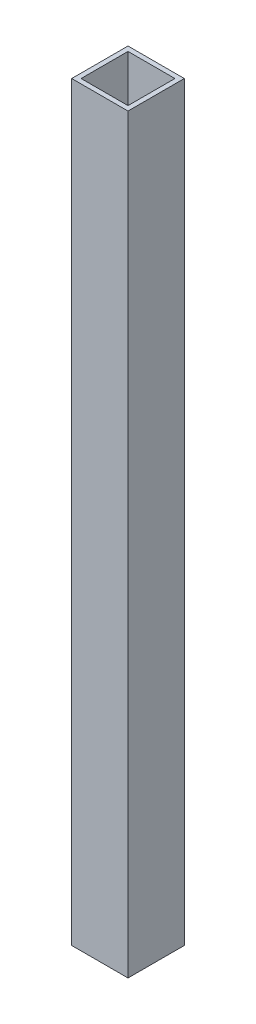
ISO-10303-21;
HEADER;
FILE_DESCRIPTION(('STEP AP214'),'2;1');
FILE_NAME('part.step','',(''),(''),'','','');
FILE_SCHEMA(('AUTOMOTIVE_DESIGN { 1 0 10303 214 1 1 1 1 }'));
ENDSEC;
DATA;
#1=APPLICATION_CONTEXT('core data for automotive mechanical design processes');
#2=APPLICATION_PROTOCOL_DEFINITION('international standard','automotive_design',2000,#1);
#3=PRODUCT_CONTEXT('',#1,'mechanical');
#4=PRODUCT('Part','Part','',(#3));
#5=PRODUCT_RELATED_PRODUCT_CATEGORY('part','',(#4));
#6=PRODUCT_DEFINITION_FORMATION('','',#4);
#7=PRODUCT_DEFINITION_CONTEXT('part definition',#1,'design');
#8=PRODUCT_DEFINITION('design','',#6,#7);
#9=PRODUCT_DEFINITION_SHAPE('','',#8);
#10=(LENGTH_UNIT() NAMED_UNIT(*) SI_UNIT(.MILLI.,.METRE.));
#11=(NAMED_UNIT(*) PLANE_ANGLE_UNIT() SI_UNIT($,.RADIAN.));
#12=(NAMED_UNIT(*) SI_UNIT($,.STERADIAN.) SOLID_ANGLE_UNIT());
#13=UNCERTAINTY_MEASURE_WITH_UNIT(LENGTH_MEASURE(1.E-05),#10,'distance_accuracy_value','');
#14=(GEOMETRIC_REPRESENTATION_CONTEXT(3) GLOBAL_UNCERTAINTY_ASSIGNED_CONTEXT((#13)) GLOBAL_UNIT_ASSIGNED_CONTEXT((#10,
#11,#12)) REPRESENTATION_CONTEXT('',''));
#15=CARTESIAN_POINT('',(0.,0.,0.));
#16=DIRECTION('',(0.,0.,1.));
#17=DIRECTION('',(1.,0.,0.));
#18=AXIS2_PLACEMENT_3D('',#15,#16,#17);
#19=CARTESIAN_POINT('',(0.,254.,0.));
#20=DIRECTION('',(0.,1.,0.));
#21=DIRECTION('',(0.,0.,1.));
#22=AXIS2_PLACEMENT_3D('',#19,#20,#21);
#23=PLANE('',#22);
#24=DIRECTION('',(0.,0.,1.));
#25=VECTOR('',#24,1.);
#26=CARTESIAN_POINT('',(0.,254.,0.));
#27=LINE('',#26,#25);
#28=CARTESIAN_POINT('',(0.,254.,-19.05));
#29=VERTEX_POINT('',#28);
#30=CARTESIAN_POINT('',(0.,254.,0.));
#31=VERTEX_POINT('',#30);
#32=EDGE_CURVE('E158',#29,#31,#27,.T.);
#33=ORIENTED_EDGE('',*,*,#32,.T.);
#34=DIRECTION('',(1.,0.,0.));
#35=VECTOR('',#34,1.);
#36=CARTESIAN_POINT('',(0.,254.,0.));
#37=LINE('',#36,#35);
#38=CARTESIAN_POINT('',(19.05,254.,0.));
#39=VERTEX_POINT('',#38);
#40=EDGE_CURVE('E161',#31,#39,#37,.T.);
#41=ORIENTED_EDGE('',*,*,#40,.T.);
#42=DIRECTION('',(0.,0.,-1.));
#43=VECTOR('',#42,1.);
#44=CARTESIAN_POINT('',(19.05,254.,0.));
#45=LINE('',#44,#43);
#46=CARTESIAN_POINT('',(19.05,254.,-19.05));
#47=VERTEX_POINT('',#46);
#48=EDGE_CURVE('E164',#39,#47,#45,.T.);
#49=ORIENTED_EDGE('',*,*,#48,.T.);
#50=DIRECTION('',(-1.,0.,0.));
#51=VECTOR('',#50,1.);
#52=CARTESIAN_POINT('',(0.,254.,-19.05));
#53=LINE('',#52,#51);
#54=EDGE_CURVE('E166',#47,#29,#53,.T.);
#55=ORIENTED_EDGE('',*,*,#54,.T.);
#56=EDGE_LOOP('',(#33,#41,#49,#55));
#57=FACE_BOUND('',#56,.T.);
#58=DIRECTION('',(1.,0.,0.));
#59=VECTOR('',#58,1.);
#60=CARTESIAN_POINT('',(0.,254.,-1.5875));
#61=LINE('',#60,#59);
#62=CARTESIAN_POINT('',(1.5875,254.,-1.5875));
#63=VERTEX_POINT('',#62);
#64=CARTESIAN_POINT('',(17.4625,254.,-1.5875));
#65=VERTEX_POINT('',#64);
#66=EDGE_CURVE('E130',#63,#65,#61,.T.);
#67=ORIENTED_EDGE('',*,*,#66,.F.);
#68=DIRECTION('',(0.,0.,1.));
#69=VECTOR('',#68,1.);
#70=CARTESIAN_POINT('',(1.5875,254.,0.));
#71=LINE('',#70,#69);
#72=CARTESIAN_POINT('',(1.5875,254.,-17.4625));
#73=VERTEX_POINT('',#72);
#74=EDGE_CURVE('E122',#73,#63,#71,.T.);
#75=ORIENTED_EDGE('',*,*,#74,.F.);
#76=DIRECTION('',(-1.,0.,0.));
#77=VECTOR('',#76,1.);
#78=CARTESIAN_POINT('',(0.,254.,-17.4625));
#79=LINE('',#78,#77);
#80=CARTESIAN_POINT('',(17.4625,254.,-17.4625));
#81=VERTEX_POINT('',#80);
#82=EDGE_CURVE('E144',#81,#73,#79,.T.);
#83=ORIENTED_EDGE('',*,*,#82,.F.);
#84=DIRECTION('',(0.,0.,-1.));
#85=VECTOR('',#84,1.);
#86=CARTESIAN_POINT('',(17.4625,254.,0.));
#87=LINE('',#86,#85);
#88=EDGE_CURVE('E142',#65,#81,#87,.T.);
#89=ORIENTED_EDGE('',*,*,#88,.F.);
#90=EDGE_LOOP('',(#67,#75,#83,#89));
#91=FACE_BOUND('',#90,.T.);
#92=ADVANCED_FACE('F57',(#57,#91),#23,.T.);
#93=CARTESIAN_POINT('',(0.,0.,0.));
#94=DIRECTION('',(0.,1.,0.));
#95=DIRECTION('',(0.,0.,1.));
#96=AXIS2_PLACEMENT_3D('',#93,#94,#95);
#97=PLANE('',#96);
#98=DIRECTION('',(0.,0.,1.));
#99=VECTOR('',#98,1.);
#100=CARTESIAN_POINT('',(0.,0.,0.));
#101=LINE('',#100,#99);
#102=CARTESIAN_POINT('',(0.,0.,-19.05));
#103=VERTEX_POINT('',#102);
#104=CARTESIAN_POINT('',(0.,0.,0.));
#105=VERTEX_POINT('',#104);
#106=EDGE_CURVE('E138',#103,#105,#101,.T.);
#107=ORIENTED_EDGE('',*,*,#106,.F.);
#108=DIRECTION('',(-1.,0.,0.));
#109=VECTOR('',#108,1.);
#110=CARTESIAN_POINT('',(0.,0.,-19.05));
#111=LINE('',#110,#109);
#112=CARTESIAN_POINT('',(19.05,0.,-19.05));
#113=VERTEX_POINT('',#112);
#114=EDGE_CURVE('E162',#113,#103,#111,.T.);
#115=ORIENTED_EDGE('',*,*,#114,.F.);
#116=DIRECTION('',(0.,0.,-1.));
#117=VECTOR('',#116,1.);
#118=CARTESIAN_POINT('',(19.05,0.,0.));
#119=LINE('',#118,#117);
#120=CARTESIAN_POINT('',(19.05,0.,0.));
#121=VERTEX_POINT('',#120);
#122=EDGE_CURVE('E173',#121,#113,#119,.T.);
#123=ORIENTED_EDGE('',*,*,#122,.F.);
#124=DIRECTION('',(1.,0.,0.));
#125=VECTOR('',#124,1.);
#126=CARTESIAN_POINT('',(0.,0.,0.));
#127=LINE('',#126,#125);
#128=EDGE_CURVE('E171',#105,#121,#127,.T.);
#129=ORIENTED_EDGE('',*,*,#128,.F.);
#130=EDGE_LOOP('',(#107,#115,#123,#129));
#131=FACE_BOUND('',#130,.T.);
#132=DIRECTION('',(0.,0.,1.));
#133=VECTOR('',#132,1.);
#134=CARTESIAN_POINT('',(1.5875,0.,0.));
#135=LINE('',#134,#133);
#136=CARTESIAN_POINT('',(1.5875,0.,-17.4625));
#137=VERTEX_POINT('',#136);
#138=CARTESIAN_POINT('',(1.5875,0.,-1.5875));
#139=VERTEX_POINT('',#138);
#140=EDGE_CURVE('E80',#137,#139,#135,.T.);
#141=ORIENTED_EDGE('',*,*,#140,.T.);
#142=DIRECTION('',(1.,0.,0.));
#143=VECTOR('',#142,1.);
#144=CARTESIAN_POINT('',(0.,0.,-1.5875));
#145=LINE('',#144,#143);
#146=CARTESIAN_POINT('',(17.4625,0.,-1.5875));
#147=VERTEX_POINT('',#146);
#148=EDGE_CURVE('E137',#139,#147,#145,.T.);
#149=ORIENTED_EDGE('',*,*,#148,.T.);
#150=DIRECTION('',(0.,0.,-1.));
#151=VECTOR('',#150,1.);
#152=CARTESIAN_POINT('',(17.4625,0.,0.));
#153=LINE('',#152,#151);
#154=CARTESIAN_POINT('',(17.4625,0.,-17.4625));
#155=VERTEX_POINT('',#154);
#156=EDGE_CURVE('E150',#147,#155,#153,.T.);
#157=ORIENTED_EDGE('',*,*,#156,.T.);
#158=DIRECTION('',(-1.,0.,0.));
#159=VECTOR('',#158,1.);
#160=CARTESIAN_POINT('',(0.,0.,-17.4625));
#161=LINE('',#160,#159);
#162=EDGE_CURVE('E131',#155,#137,#161,.T.);
#163=ORIENTED_EDGE('',*,*,#162,.T.);
#164=EDGE_LOOP('',(#141,#149,#157,#163));
#165=FACE_BOUND('',#164,.T.);
#166=ADVANCED_FACE('F191',(#131,#165),#97,.F.);
#167=CARTESIAN_POINT('',(0.,254.,0.));
#168=DIRECTION('',(1.,0.,0.));
#169=DIRECTION('',(0.,0.,-1.));
#170=AXIS2_PLACEMENT_3D('',#167,#168,#169);
#171=PLANE('',#170);
#172=ORIENTED_EDGE('',*,*,#106,.T.);
#173=DIRECTION('',(0.,-1.,0.));
#174=VECTOR('',#173,1.);
#175=CARTESIAN_POINT('',(0.,254.,0.));
#176=LINE('',#175,#174);
#177=EDGE_CURVE('E12',#31,#105,#176,.T.);
#178=ORIENTED_EDGE('',*,*,#177,.F.);
#179=ORIENTED_EDGE('',*,*,#32,.F.);
#180=DIRECTION('',(0.,-1.,0.));
#181=VECTOR('',#180,1.);
#182=CARTESIAN_POINT('',(0.,254.,-19.05));
#183=LINE('',#182,#181);
#184=EDGE_CURVE('E168',#29,#103,#183,.T.);
#185=ORIENTED_EDGE('',*,*,#184,.T.);
#186=EDGE_LOOP('',(#172,#178,#179,#185));
#187=FACE_BOUND('',#186,.T.);
#188=ADVANCED_FACE('F59',(#187),#171,.F.);
#189=CARTESIAN_POINT('',(0.,254.,0.));
#190=DIRECTION('',(0.,0.,-1.));
#191=DIRECTION('',(-1.,0.,0.));
#192=AXIS2_PLACEMENT_3D('',#189,#190,#191);
#193=PLANE('',#192);
#194=ORIENTED_EDGE('',*,*,#128,.T.);
#195=DIRECTION('',(0.,-1.,0.));
#196=VECTOR('',#195,1.);
#197=CARTESIAN_POINT('',(19.05,254.,0.));
#198=LINE('',#197,#196);
#199=EDGE_CURVE('E65',#39,#121,#198,.T.);
#200=ORIENTED_EDGE('',*,*,#199,.F.);
#201=ORIENTED_EDGE('',*,*,#40,.F.);
#202=ORIENTED_EDGE('',*,*,#177,.T.);
#203=EDGE_LOOP('',(#194,#200,#201,#202));
#204=FACE_BOUND('',#203,.T.);
#205=ADVANCED_FACE('F201',(#204),#193,.F.);
#206=CARTESIAN_POINT('',(19.05,254.,0.));
#207=DIRECTION('',(-1.,0.,0.));
#208=DIRECTION('',(0.,0.,1.));
#209=AXIS2_PLACEMENT_3D('',#206,#207,#208);
#210=PLANE('',#209);
#211=ORIENTED_EDGE('',*,*,#122,.T.);
#212=DIRECTION('',(0.,-1.,0.));
#213=VECTOR('',#212,1.);
#214=CARTESIAN_POINT('',(19.05,254.,-19.05));
#215=LINE('',#214,#213);
#216=EDGE_CURVE('E178',#47,#113,#215,.T.);
#217=ORIENTED_EDGE('',*,*,#216,.F.);
#218=ORIENTED_EDGE('',*,*,#48,.F.);
#219=ORIENTED_EDGE('',*,*,#199,.T.);
#220=EDGE_LOOP('',(#211,#217,#218,#219));
#221=FACE_BOUND('',#220,.T.);
#222=ADVANCED_FACE('F185',(#221),#210,.F.);
#223=CARTESIAN_POINT('',(0.,254.,-19.05));
#224=DIRECTION('',(0.,0.,1.));
#225=DIRECTION('',(1.,0.,0.));
#226=AXIS2_PLACEMENT_3D('',#223,#224,#225);
#227=PLANE('',#226);
#228=ORIENTED_EDGE('',*,*,#114,.T.);
#229=ORIENTED_EDGE('',*,*,#184,.F.);
#230=ORIENTED_EDGE('',*,*,#54,.F.);
#231=ORIENTED_EDGE('',*,*,#216,.T.);
#232=EDGE_LOOP('',(#228,#229,#230,#231));
#233=FACE_BOUND('',#232,.T.);
#234=ADVANCED_FACE('F195',(#233),#227,.F.);
#235=CARTESIAN_POINT('',(1.5875,254.,0.));
#236=DIRECTION('',(1.,0.,0.));
#237=DIRECTION('',(0.,0.,-1.));
#238=AXIS2_PLACEMENT_3D('',#235,#236,#237);
#239=PLANE('',#238);
#240=ORIENTED_EDGE('',*,*,#140,.F.);
#241=DIRECTION('',(0.,-1.,0.));
#242=VECTOR('',#241,1.);
#243=CARTESIAN_POINT('',(1.5875,254.,-17.4625));
#244=LINE('',#243,#242);
#245=EDGE_CURVE('E126',#73,#137,#244,.T.);
#246=ORIENTED_EDGE('',*,*,#245,.F.);
#247=ORIENTED_EDGE('',*,*,#74,.T.);
#248=DIRECTION('',(0.,-1.,0.));
#249=VECTOR('',#248,1.);
#250=CARTESIAN_POINT('',(1.5875,254.,-1.5875));
#251=LINE('',#250,#249);
#252=EDGE_CURVE('E125',#63,#139,#251,.T.);
#253=ORIENTED_EDGE('',*,*,#252,.T.);
#254=EDGE_LOOP('',(#240,#246,#247,#253));
#255=FACE_BOUND('',#254,.T.);
#256=ADVANCED_FACE('F124',(#255),#239,.T.);
#257=CARTESIAN_POINT('',(0.,254.,-1.5875));
#258=DIRECTION('',(0.,0.,-1.));
#259=DIRECTION('',(-1.,0.,0.));
#260=AXIS2_PLACEMENT_3D('',#257,#258,#259);
#261=PLANE('',#260);
#262=ORIENTED_EDGE('',*,*,#148,.F.);
#263=ORIENTED_EDGE('',*,*,#252,.F.);
#264=ORIENTED_EDGE('',*,*,#66,.T.);
#265=DIRECTION('',(0.,-1.,0.));
#266=VECTOR('',#265,1.);
#267=CARTESIAN_POINT('',(17.4625,254.,-1.5875));
#268=LINE('',#267,#266);
#269=EDGE_CURVE('E139',#65,#147,#268,.T.);
#270=ORIENTED_EDGE('',*,*,#269,.T.);
#271=EDGE_LOOP('',(#262,#263,#264,#270));
#272=FACE_BOUND('',#271,.T.);
#273=ADVANCED_FACE('F134',(#272),#261,.T.);
#274=CARTESIAN_POINT('',(17.4625,254.,0.));
#275=DIRECTION('',(-1.,0.,0.));
#276=DIRECTION('',(0.,0.,1.));
#277=AXIS2_PLACEMENT_3D('',#274,#275,#276);
#278=PLANE('',#277);
#279=ORIENTED_EDGE('',*,*,#156,.F.);
#280=ORIENTED_EDGE('',*,*,#269,.F.);
#281=ORIENTED_EDGE('',*,*,#88,.T.);
#282=DIRECTION('',(0.,-1.,0.));
#283=VECTOR('',#282,1.);
#284=CARTESIAN_POINT('',(17.4625,254.,-17.4625));
#285=LINE('',#284,#283);
#286=EDGE_CURVE('E72',#81,#155,#285,.T.);
#287=ORIENTED_EDGE('',*,*,#286,.T.);
#288=EDGE_LOOP('',(#279,#280,#281,#287));
#289=FACE_BOUND('',#288,.T.);
#290=ADVANCED_FACE('F224',(#289),#278,.T.);
#291=CARTESIAN_POINT('',(0.,254.,-17.4625));
#292=DIRECTION('',(0.,0.,1.));
#293=DIRECTION('',(1.,0.,0.));
#294=AXIS2_PLACEMENT_3D('',#291,#292,#293);
#295=PLANE('',#294);
#296=ORIENTED_EDGE('',*,*,#162,.F.);
#297=ORIENTED_EDGE('',*,*,#286,.F.);
#298=ORIENTED_EDGE('',*,*,#82,.T.);
#299=ORIENTED_EDGE('',*,*,#245,.T.);
#300=EDGE_LOOP('',(#296,#297,#298,#299));
#301=FACE_BOUND('',#300,.T.);
#302=ADVANCED_FACE('F228',(#301),#295,.T.);
#303=CLOSED_SHELL('',(#92,#166,#188,#205,#222,#234,#256,#273,#290,#302));
#304=MANIFOLD_SOLID_BREP('B2',#303);
#305=ADVANCED_BREP_SHAPE_REPRESENTATION('',(#18,#304),#14);
#306=SHAPE_DEFINITION_REPRESENTATION(#9,#305);
ENDSEC;
END-ISO-10303-21;
